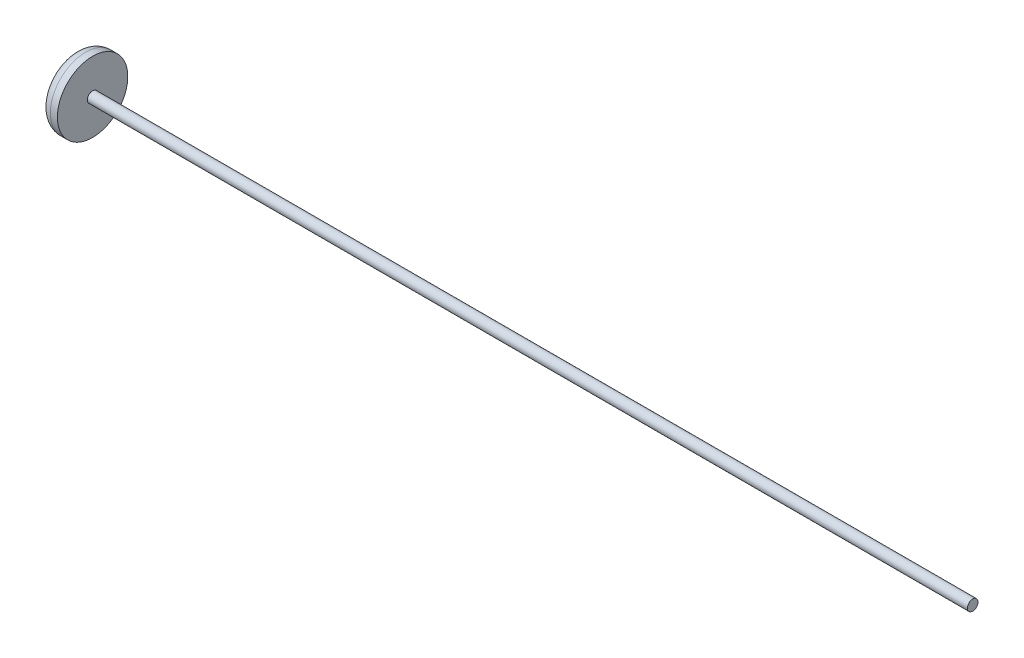
ISO-10303-21;
HEADER;
FILE_DESCRIPTION(('STEP AP214'),'2;1');
FILE_NAME('part.step','',(''),(''),'','','');
FILE_SCHEMA(('AUTOMOTIVE_DESIGN { 1 0 10303 214 1 1 1 1 }'));
ENDSEC;
DATA;
#1=APPLICATION_CONTEXT('core data for automotive mechanical design processes');
#2=APPLICATION_PROTOCOL_DEFINITION('international standard','automotive_design',2000,#1);
#3=PRODUCT_CONTEXT('',#1,'mechanical');
#4=PRODUCT('Part','Part','',(#3));
#5=PRODUCT_RELATED_PRODUCT_CATEGORY('part','',(#4));
#6=PRODUCT_DEFINITION_FORMATION('','',#4);
#7=PRODUCT_DEFINITION_CONTEXT('part definition',#1,'design');
#8=PRODUCT_DEFINITION('design','',#6,#7);
#9=PRODUCT_DEFINITION_SHAPE('','',#8);
#10=(LENGTH_UNIT() NAMED_UNIT(*) SI_UNIT(.MILLI.,.METRE.));
#11=(NAMED_UNIT(*) PLANE_ANGLE_UNIT() SI_UNIT($,.RADIAN.));
#12=(NAMED_UNIT(*) SI_UNIT($,.STERADIAN.) SOLID_ANGLE_UNIT());
#13=UNCERTAINTY_MEASURE_WITH_UNIT(LENGTH_MEASURE(1.E-05),#10,'distance_accuracy_value','');
#14=(GEOMETRIC_REPRESENTATION_CONTEXT(3) GLOBAL_UNCERTAINTY_ASSIGNED_CONTEXT((#13)) GLOBAL_UNIT_ASSIGNED_CONTEXT((#10,
#11,#12)) REPRESENTATION_CONTEXT('',''));
#15=CARTESIAN_POINT('',(0.,0.,0.));
#16=DIRECTION('',(0.,0.,1.));
#17=DIRECTION('',(1.,0.,0.));
#18=AXIS2_PLACEMENT_3D('',#15,#16,#17);
#19=CARTESIAN_POINT('',(25.,0.,0.));
#20=DIRECTION('',(-1.,0.,0.));
#21=DIRECTION('',(0.,0.,1.));
#22=AXIS2_PLACEMENT_3D('',#19,#20,#21);
#23=CYLINDRICAL_SURFACE('',#22,0.15);
#24=CARTESIAN_POINT('',(25.,0.,0.));
#25=DIRECTION('',(1.,0.,0.));
#26=DIRECTION('',(0.,0.,-1.));
#27=AXIS2_PLACEMENT_3D('',#24,#25,#26);
#28=CIRCLE('',#27,0.15);
#29=CARTESIAN_POINT('',(25.,0.,-0.15));
#30=VERTEX_POINT('',#29);
#31=EDGE_CURVE('E41',#30,#30,#28,.T.);
#32=ORIENTED_EDGE('',*,*,#31,.F.);
#33=EDGE_LOOP('',(#32));
#34=FACE_BOUND('',#33,.T.);
#35=CARTESIAN_POINT('',(0.,0.,0.));
#36=DIRECTION('',(-1.,0.,0.));
#37=DIRECTION('',(0.,0.,1.));
#38=AXIS2_PLACEMENT_3D('',#35,#36,#37);
#39=CIRCLE('',#38,0.15);
#40=CARTESIAN_POINT('',(0.,0.,0.15));
#41=VERTEX_POINT('',#40);
#42=EDGE_CURVE('E45',#41,#41,#39,.T.);
#43=ORIENTED_EDGE('',*,*,#42,.F.);
#44=EDGE_LOOP('',(#43));
#45=FACE_BOUND('',#44,.T.);
#46=ADVANCED_FACE('F30',(#34,#45),#23,.T.);
#47=CARTESIAN_POINT('',(25.,0.,0.));
#48=DIRECTION('',(1.,0.,0.));
#49=DIRECTION('',(0.,0.,-1.));
#50=AXIS2_PLACEMENT_3D('',#47,#48,#49);
#51=PLANE('',#50);
#52=ORIENTED_EDGE('',*,*,#31,.T.);
#53=EDGE_LOOP('',(#52));
#54=FACE_BOUND('',#53,.T.);
#55=ADVANCED_FACE('F59',(#54),#51,.T.);
#56=CARTESIAN_POINT('',(0.,0.,0.));
#57=DIRECTION('',(-1.,0.,0.));
#58=DIRECTION('',(0.,0.,1.));
#59=AXIS2_PLACEMENT_3D('',#56,#57,#58);
#60=PLANE('',#59);
#61=CARTESIAN_POINT('',(0.,0.,0.));
#62=DIRECTION('',(-1.,0.,0.));
#63=DIRECTION('',(0.,0.,1.));
#64=AXIS2_PLACEMENT_3D('',#61,#62,#63);
#65=CIRCLE('',#64,1.);
#66=CARTESIAN_POINT('',(0.,0.,1.));
#67=VERTEX_POINT('',#66);
#68=EDGE_CURVE('E50',#67,#67,#65,.T.);
#69=ORIENTED_EDGE('',*,*,#68,.F.);
#70=EDGE_LOOP('',(#69));
#71=FACE_BOUND('',#70,.T.);
#72=ORIENTED_EDGE('',*,*,#42,.T.);
#73=EDGE_LOOP('',(#72));
#74=FACE_BOUND('',#73,.T.);
#75=ADVANCED_FACE('F56',(#71,#74),#60,.F.);
#76=CARTESIAN_POINT('',(-0.5,0.,0.));
#77=DIRECTION('',(1.,0.,0.));
#78=DIRECTION('',(0.,0.,-1.));
#79=AXIS2_PLACEMENT_3D('',#76,#77,#78);
#80=CYLINDRICAL_SURFACE('',#79,1.);
#81=CARTESIAN_POINT('',(-0.2,0.,0.));
#82=DIRECTION('',(-1.,0.,0.));
#83=DIRECTION('',(0.,0.,1.));
#84=AXIS2_PLACEMENT_3D('',#81,#82,#83);
#85=CIRCLE('',#84,1.);
#86=CARTESIAN_POINT('',(-0.2,0.,1.));
#87=VERTEX_POINT('',#86);
#88=EDGE_CURVE('E10',#87,#87,#85,.F.);
#89=ORIENTED_EDGE('',*,*,#88,.T.);
#90=EDGE_LOOP('',(#89));
#91=FACE_BOUND('',#90,.T.);
#92=ORIENTED_EDGE('',*,*,#68,.T.);
#93=EDGE_LOOP('',(#92));
#94=FACE_BOUND('',#93,.T.);
#95=ADVANCED_FACE('F54',(#91,#94),#80,.T.);
#96=CARTESIAN_POINT('',(-0.5,0.,0.));
#97=DIRECTION('',(-1.,0.,0.));
#98=DIRECTION('',(0.,0.,1.));
#99=AXIS2_PLACEMENT_3D('',#96,#97,#98);
#100=PLANE('',#99);
#101=CARTESIAN_POINT('',(-0.5,0.,0.));
#102=DIRECTION('',(-1.,0.,0.));
#103=DIRECTION('',(0.,0.,1.));
#104=AXIS2_PLACEMENT_3D('',#101,#102,#103);
#105=CIRCLE('',#104,0.7);
#106=CARTESIAN_POINT('',(-0.5,0.,0.7));
#107=VERTEX_POINT('',#106);
#108=EDGE_CURVE('E37',#107,#107,#105,.T.);
#109=ORIENTED_EDGE('',*,*,#108,.T.);
#110=EDGE_LOOP('',(#109));
#111=FACE_BOUND('',#110,.T.);
#112=ADVANCED_FACE('F73',(#111),#100,.T.);
#113=CARTESIAN_POINT('',(-0.2,0.,0.));
#114=DIRECTION('',(-1.,0.,0.));
#115=DIRECTION('',(0.,0.,1.));
#116=AXIS2_PLACEMENT_3D('',#113,#114,#115);
#117=TOROIDAL_SURFACE('',#116,0.7,0.3);
#118=ORIENTED_EDGE('',*,*,#88,.F.);
#119=EDGE_LOOP('',(#118));
#120=FACE_BOUND('',#119,.T.);
#121=ORIENTED_EDGE('',*,*,#108,.F.);
#122=EDGE_LOOP('',(#121));
#123=FACE_BOUND('',#122,.T.);
#124=ADVANCED_FACE('F32',(#120,#123),#117,.T.);
#125=CLOSED_SHELL('',(#46,#55,#75,#95,#112,#124));
#126=MANIFOLD_SOLID_BREP('B2',#125);
#127=ADVANCED_BREP_SHAPE_REPRESENTATION('',(#18,#126),#14);
#128=SHAPE_DEFINITION_REPRESENTATION(#9,#127);
ENDSEC;
END-ISO-10303-21;
